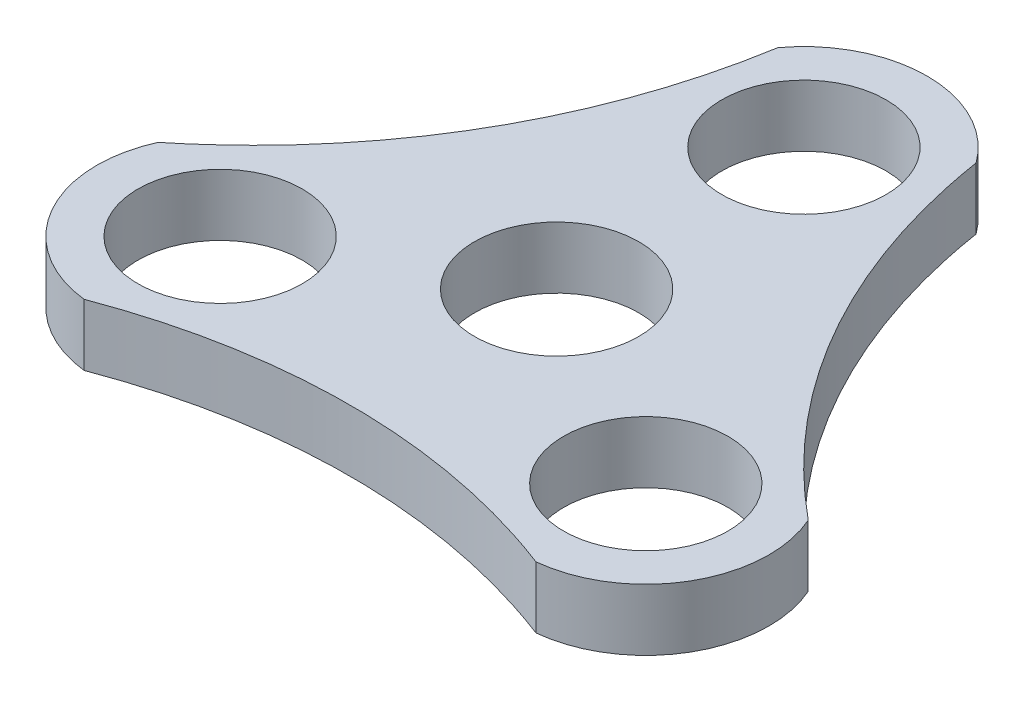
ISO-10303-21;
HEADER;
FILE_DESCRIPTION(('STEP AP214'),'2;1');
FILE_NAME('part.step','',(''),(''),'','','');
FILE_SCHEMA(('AUTOMOTIVE_DESIGN { 1 0 10303 214 1 1 1 1 }'));
ENDSEC;
DATA;
#1=APPLICATION_CONTEXT('core data for automotive mechanical design processes');
#2=APPLICATION_PROTOCOL_DEFINITION('international standard','automotive_design',2000,#1);
#3=PRODUCT_CONTEXT('',#1,'mechanical');
#4=PRODUCT('Part','Part','',(#3));
#5=PRODUCT_RELATED_PRODUCT_CATEGORY('part','',(#4));
#6=PRODUCT_DEFINITION_FORMATION('','',#4);
#7=PRODUCT_DEFINITION_CONTEXT('part definition',#1,'design');
#8=PRODUCT_DEFINITION('design','',#6,#7);
#9=PRODUCT_DEFINITION_SHAPE('','',#8);
#10=(LENGTH_UNIT() NAMED_UNIT(*) SI_UNIT(.MILLI.,.METRE.));
#11=(NAMED_UNIT(*) PLANE_ANGLE_UNIT() SI_UNIT($,.RADIAN.));
#12=(NAMED_UNIT(*) SI_UNIT($,.STERADIAN.) SOLID_ANGLE_UNIT());
#13=UNCERTAINTY_MEASURE_WITH_UNIT(LENGTH_MEASURE(1.E-05),#10,'distance_accuracy_value','');
#14=(GEOMETRIC_REPRESENTATION_CONTEXT(3) GLOBAL_UNCERTAINTY_ASSIGNED_CONTEXT((#13)) GLOBAL_UNIT_ASSIGNED_CONTEXT((#10,
#11,#12)) REPRESENTATION_CONTEXT('',''));
#15=CARTESIAN_POINT('',(0.,0.,0.));
#16=DIRECTION('',(0.,0.,1.));
#17=DIRECTION('',(1.,0.,0.));
#18=AXIS2_PLACEMENT_3D('',#15,#16,#17);
#19=CARTESIAN_POINT('',(-13.602275297926,4.7625,-7.91869783549676));
#20=DIRECTION('',(0.,1.,0.));
#21=DIRECTION('',(0.,0.,1.));
#22=AXIS2_PLACEMENT_3D('',#19,#20,#21);
#23=PLANE('',#22);
#24=CARTESIAN_POINT('',(16.4678313299762,4.7625,9.57669208482001));
#25=DIRECTION('',(0.,1.,0.));
#26=DIRECTION('',(0.,0.,1.));
#27=AXIS2_PLACEMENT_3D('',#24,#25,#26);
#28=CIRCLE('',#27,6.35);
#29=CARTESIAN_POINT('',(16.4678313299762,4.7625,3.22669208482001));
#30=VERTEX_POINT('',#29);
#31=EDGE_CURVE('E163',#30,#30,#28,.T.);
#32=ORIENTED_EDGE('',*,*,#31,.F.);
#33=EDGE_LOOP('',(#32));
#34=FACE_BOUND('',#33,.T.);
#35=CARTESIAN_POINT('',(0.,4.7625,0.));
#36=DIRECTION('',(0.,1.,0.));
#37=DIRECTION('',(0.,0.,1.));
#38=AXIS2_PLACEMENT_3D('',#35,#36,#37);
#39=CIRCLE('',#38,6.35);
#40=CARTESIAN_POINT('',(0.,4.7625,-6.35));
#41=VERTEX_POINT('',#40);
#42=EDGE_CURVE('E155',#41,#41,#39,.T.);
#43=ORIENTED_EDGE('',*,*,#42,.F.);
#44=EDGE_LOOP('',(#43));
#45=FACE_BOUND('',#44,.T.);
#46=CARTESIAN_POINT('',(-7.61008297032419,4.7625,-24.6978612702383));
#47=CARTESIAN_POINT('',(-9.59210410471239,4.7625,-12.6493938133161));
#48=CARTESIAN_POINT('',(-15.7358593196995,4.7625,-2.09722589880707));
#49=CARTESIAN_POINT('',(-25.2242291398482,4.7625,5.58813772263381));
#50=B_SPLINE_CURVE_WITH_KNOTS('',3,(#46,#47,#48,#49),.UNSPECIFIED.,.F.,.F.,(4,4),(0.,1.),.UNSPECIFIED.);
#51=CARTESIAN_POINT('',(-7.61008297032419,4.7625,-24.6978612702383));
#52=VERTEX_POINT('',#51);
#53=CARTESIAN_POINT('',(-25.2242291398482,4.7625,5.5881377226338));
#54=VERTEX_POINT('',#53);
#55=EDGE_CURVE('E144',#52,#54,#50,.T.);
#56=ORIENTED_EDGE('',*,*,#55,.T.);
#57=CARTESIAN_POINT('',(-16.5275742946636,4.7625,9.47321423458667));
#58=DIRECTION('',(0.,1.,0.));
#59=DIRECTION('',(0.,0.,1.));
#60=AXIS2_PLACEMENT_3D('',#57,#58,#59);
#61=CIRCLE('',#60,9.525);
#62=CARTESIAN_POINT('',(-17.5771173695649,4.7625,18.9402139881478));
#63=VERTEX_POINT('',#62);
#64=EDGE_CURVE('E88',#54,#63,#61,.T.);
#65=ORIENTED_EDGE('',*,*,#64,.T.);
#66=CARTESIAN_POINT('',(-17.5771173695649,4.7625,18.9402139881478));
#67=CARTESIAN_POINT('',(-6.15200852896618,4.7625,14.6319818892297));
#68=CARTESIAN_POINT('',(6.05831641519707,4.7625,14.6760340812267));
#69=CARTESIAN_POINT('',(17.4584048576285,4.7625,19.0500436082416));
#70=B_SPLINE_CURVE_WITH_KNOTS('',3,(#66,#67,#68,#69),.UNSPECIFIED.,.F.,.F.,(4,4),(0.,1.),.UNSPECIFIED.);
#71=CARTESIAN_POINT('',(17.4584048576285,4.7625,19.0500436082416));
#72=VERTEX_POINT('',#71);
#73=EDGE_CURVE('E101',#63,#72,#70,.T.);
#74=ORIENTED_EDGE('',*,*,#73,.T.);
#75=CARTESIAN_POINT('',(16.4678313299762,4.7625,9.57669208482001));
#76=DIRECTION('',(0.,1.,0.));
#77=DIRECTION('',(0.,0.,1.));
#78=AXIS2_PLACEMENT_3D('',#75,#76,#77);
#79=CIRCLE('',#78,9.525);
#80=CARTESIAN_POINT('',(25.1877510255061,4.7625,5.74411781893687));
#81=VERTEX_POINT('',#80);
#82=EDGE_CURVE('E95',#72,#81,#79,.T.);
#83=ORIENTED_EDGE('',*,*,#82,.T.);
#84=CARTESIAN_POINT('',(25.1877510255061,4.7625,5.74411781893687));
#85=CARTESIAN_POINT('',(15.7437444551005,4.7625,-1.99569585684444));
#86=CARTESIAN_POINT('',(9.67616592661354,4.7625,-12.5918492456133));
#87=CARTESIAN_POINT('',(7.76348047936323,4.7625,-24.6515179897187));
#88=B_SPLINE_CURVE_WITH_KNOTS('',3,(#84,#85,#86,#87),.UNSPECIFIED.,.F.,.F.,(4,4),(0.,1.),.UNSPECIFIED.);
#89=CARTESIAN_POINT('',(7.76348047936323,4.7625,-24.6515179897187));
#90=VERTEX_POINT('',#89);
#91=EDGE_CURVE('E99',#81,#90,#88,.T.);
#92=ORIENTED_EDGE('',*,*,#91,.T.);
#93=CARTESIAN_POINT('',(0.0597429646873883,4.7625,-19.0499063194067));
#94=DIRECTION('',(0.,1.,0.));
#95=DIRECTION('',(0.,0.,1.));
#96=AXIS2_PLACEMENT_3D('',#93,#94,#95);
#97=CIRCLE('',#96,9.525);
#98=EDGE_CURVE('E51',#90,#52,#97,.T.);
#99=ORIENTED_EDGE('',*,*,#98,.T.);
#100=EDGE_LOOP('',(#56,#65,#74,#83,#92,#99));
#101=FACE_BOUND('',#100,.T.);
#102=CARTESIAN_POINT('',(0.0597429646873883,4.7625,-19.0499063194067));
#103=DIRECTION('',(0.,1.,0.));
#104=DIRECTION('',(0.,0.,1.));
#105=AXIS2_PLACEMENT_3D('',#102,#103,#104);
#106=CIRCLE('',#105,6.35);
#107=CARTESIAN_POINT('',(0.0597429646873883,4.7625,-25.3999063194067));
#108=VERTEX_POINT('',#107);
#109=EDGE_CURVE('E156',#108,#108,#106,.T.);
#110=ORIENTED_EDGE('',*,*,#109,.F.);
#111=EDGE_LOOP('',(#110));
#112=FACE_BOUND('',#111,.T.);
#113=CARTESIAN_POINT('',(-16.5275742946636,4.7625,9.47321423458667));
#114=DIRECTION('',(0.,1.,0.));
#115=DIRECTION('',(0.,0.,1.));
#116=AXIS2_PLACEMENT_3D('',#113,#114,#115);
#117=CIRCLE('',#116,6.35);
#118=CARTESIAN_POINT('',(-16.5275742946636,4.7625,3.12321423458667));
#119=VERTEX_POINT('',#118);
#120=EDGE_CURVE('E169',#119,#119,#117,.T.);
#121=ORIENTED_EDGE('',*,*,#120,.F.);
#122=EDGE_LOOP('',(#121));
#123=FACE_BOUND('',#122,.T.);
#124=ADVANCED_FACE('F33',(#34,#45,#101,#112,#123),#23,.T.);
#125=CARTESIAN_POINT('',(-13.602275297926,0.,-7.91869783549676));
#126=DIRECTION('',(0.,1.,0.));
#127=DIRECTION('',(0.,0.,1.));
#128=AXIS2_PLACEMENT_3D('',#125,#126,#127);
#129=PLANE('',#128);
#130=CARTESIAN_POINT('',(-7.61008297032419,0.,-24.6978612702383));
#131=CARTESIAN_POINT('',(-9.59210410471239,0.,-12.6493938133161));
#132=CARTESIAN_POINT('',(-15.7358593196995,0.,-2.09722589880707));
#133=CARTESIAN_POINT('',(-25.2242291398482,0.,5.58813772263381));
#134=B_SPLINE_CURVE_WITH_KNOTS('',3,(#130,#131,#132,#133),.UNSPECIFIED.,.F.,.F.,(4,4),(0.,1.),.UNSPECIFIED.);
#135=CARTESIAN_POINT('',(-7.61008297032419,0.,-24.6978612702383));
#136=VERTEX_POINT('',#135);
#137=CARTESIAN_POINT('',(-25.2242291398482,0.,5.5881377226338));
#138=VERTEX_POINT('',#137);
#139=EDGE_CURVE('E159',#136,#138,#134,.T.);
#140=ORIENTED_EDGE('',*,*,#139,.F.);
#141=CARTESIAN_POINT('',(0.0597429646873883,0.,-19.0499063194067));
#142=DIRECTION('',(0.,1.,0.));
#143=DIRECTION('',(0.,0.,1.));
#144=AXIS2_PLACEMENT_3D('',#141,#142,#143);
#145=CIRCLE('',#144,9.525);
#146=CARTESIAN_POINT('',(7.76348047936323,0.,-24.6515179897187));
#147=VERTEX_POINT('',#146);
#148=EDGE_CURVE('E80',#147,#136,#145,.T.);
#149=ORIENTED_EDGE('',*,*,#148,.F.);
#150=CARTESIAN_POINT('',(25.1877510255061,0.,5.74411781893687));
#151=CARTESIAN_POINT('',(15.7437444551005,0.,-1.99569585684444));
#152=CARTESIAN_POINT('',(9.67616592661354,0.,-12.5918492456133));
#153=CARTESIAN_POINT('',(7.76348047936323,0.,-24.6515179897187));
#154=B_SPLINE_CURVE_WITH_KNOTS('',3,(#150,#151,#152,#153),.UNSPECIFIED.,.F.,.F.,(4,4),(0.,1.),.UNSPECIFIED.);
#155=CARTESIAN_POINT('',(25.1877510255061,0.,5.74411781893687));
#156=VERTEX_POINT('',#155);
#157=EDGE_CURVE('E74',#156,#147,#154,.T.);
#158=ORIENTED_EDGE('',*,*,#157,.F.);
#159=CARTESIAN_POINT('',(16.4678313299762,0.,9.57669208482001));
#160=DIRECTION('',(0.,1.,0.));
#161=DIRECTION('',(0.,0.,1.));
#162=AXIS2_PLACEMENT_3D('',#159,#160,#161);
#163=CIRCLE('',#162,9.525);
#164=CARTESIAN_POINT('',(17.4584048576285,0.,19.0500436082416));
#165=VERTEX_POINT('',#164);
#166=EDGE_CURVE('E109',#165,#156,#163,.T.);
#167=ORIENTED_EDGE('',*,*,#166,.F.);
#168=CARTESIAN_POINT('',(-17.5771173695649,0.,18.9402139881478));
#169=CARTESIAN_POINT('',(-6.15200852896618,0.,14.6319818892297));
#170=CARTESIAN_POINT('',(6.05831641519707,0.,14.6760340812267));
#171=CARTESIAN_POINT('',(17.4584048576285,0.,19.0500436082416));
#172=B_SPLINE_CURVE_WITH_KNOTS('',3,(#168,#169,#170,#171),.UNSPECIFIED.,.F.,.F.,(4,4),(0.,1.),.UNSPECIFIED.);
#173=CARTESIAN_POINT('',(-17.5771173695649,0.,18.9402139881478));
#174=VERTEX_POINT('',#173);
#175=EDGE_CURVE('E284',#174,#165,#172,.T.);
#176=ORIENTED_EDGE('',*,*,#175,.F.);
#177=CARTESIAN_POINT('',(-16.5275742946636,0.,9.47321423458667));
#178=DIRECTION('',(0.,1.,0.));
#179=DIRECTION('',(0.,0.,1.));
#180=AXIS2_PLACEMENT_3D('',#177,#178,#179);
#181=CIRCLE('',#180,9.525);
#182=EDGE_CURVE('E283',#138,#174,#181,.T.);
#183=ORIENTED_EDGE('',*,*,#182,.F.);
#184=EDGE_LOOP('',(#140,#149,#158,#167,#176,#183));
#185=FACE_BOUND('',#184,.T.);
#186=CARTESIAN_POINT('',(0.,0.,0.));
#187=DIRECTION('',(0.,1.,0.));
#188=DIRECTION('',(0.,0.,1.));
#189=AXIS2_PLACEMENT_3D('',#186,#187,#188);
#190=CIRCLE('',#189,6.35);
#191=CARTESIAN_POINT('',(0.,0.,-6.35));
#192=VERTEX_POINT('',#191);
#193=EDGE_CURVE('E149',#192,#192,#190,.T.);
#194=ORIENTED_EDGE('',*,*,#193,.T.);
#195=EDGE_LOOP('',(#194));
#196=FACE_BOUND('',#195,.T.);
#197=CARTESIAN_POINT('',(0.0597429646873883,0.,-19.0499063194067));
#198=DIRECTION('',(0.,1.,0.));
#199=DIRECTION('',(0.,0.,1.));
#200=AXIS2_PLACEMENT_3D('',#197,#198,#199);
#201=CIRCLE('',#200,6.35);
#202=CARTESIAN_POINT('',(0.0597429646873883,0.,-25.3999063194067));
#203=VERTEX_POINT('',#202);
#204=EDGE_CURVE('E160',#203,#203,#201,.T.);
#205=ORIENTED_EDGE('',*,*,#204,.T.);
#206=EDGE_LOOP('',(#205));
#207=FACE_BOUND('',#206,.T.);
#208=CARTESIAN_POINT('',(16.4678313299762,0.,9.57669208482001));
#209=DIRECTION('',(0.,1.,0.));
#210=DIRECTION('',(0.,0.,1.));
#211=AXIS2_PLACEMENT_3D('',#208,#209,#210);
#212=CIRCLE('',#211,6.35);
#213=CARTESIAN_POINT('',(16.4678313299762,0.,3.22669208482001));
#214=VERTEX_POINT('',#213);
#215=EDGE_CURVE('E166',#214,#214,#212,.T.);
#216=ORIENTED_EDGE('',*,*,#215,.T.);
#217=EDGE_LOOP('',(#216));
#218=FACE_BOUND('',#217,.T.);
#219=CARTESIAN_POINT('',(-16.5275742946636,0.,9.47321423458667));
#220=DIRECTION('',(0.,1.,0.));
#221=DIRECTION('',(0.,0.,1.));
#222=AXIS2_PLACEMENT_3D('',#219,#220,#221);
#223=CIRCLE('',#222,6.35);
#224=CARTESIAN_POINT('',(-16.5275742946636,0.,3.12321423458667));
#225=VERTEX_POINT('',#224);
#226=EDGE_CURVE('E172',#225,#225,#223,.T.);
#227=ORIENTED_EDGE('',*,*,#226,.T.);
#228=EDGE_LOOP('',(#227));
#229=FACE_BOUND('',#228,.T.);
#230=ADVANCED_FACE('F182',(#185,#196,#207,#218,#229),#129,.F.);
#231=DIRECTION('',(0.,-1.,0.));
#232=VECTOR('',#231,1.);
#233=SURFACE_OF_LINEAR_EXTRUSION('',#50,#232);
#234=ORIENTED_EDGE('',*,*,#139,.T.);
#235=DIRECTION('',(0.,-1.,0.));
#236=VECTOR('',#235,1.);
#237=CARTESIAN_POINT('',(-25.2242291398482,4.7625,5.5881377226338));
#238=LINE('',#237,#236);
#239=EDGE_CURVE('E11',#54,#138,#238,.T.);
#240=ORIENTED_EDGE('',*,*,#239,.F.);
#241=ORIENTED_EDGE('',*,*,#55,.F.);
#242=DIRECTION('',(0.,-1.,0.));
#243=VECTOR('',#242,1.);
#244=CARTESIAN_POINT('',(-7.61008297032419,4.7625,-24.6978612702383));
#245=LINE('',#244,#243);
#246=EDGE_CURVE('E115',#52,#136,#245,.T.);
#247=ORIENTED_EDGE('',*,*,#246,.T.);
#248=EDGE_LOOP('',(#234,#240,#241,#247));
#249=FACE_BOUND('',#248,.T.);
#250=ADVANCED_FACE('F35',(#249),#233,.F.);
#251=CARTESIAN_POINT('',(-16.5275742946636,4.7625,9.47321423458667));
#252=DIRECTION('',(0.,-1.,0.));
#253=DIRECTION('',(0.,0.,-1.));
#254=AXIS2_PLACEMENT_3D('',#251,#252,#253);
#255=CYLINDRICAL_SURFACE('',#254,9.525);
#256=ORIENTED_EDGE('',*,*,#182,.T.);
#257=DIRECTION('',(0.,-1.,0.));
#258=VECTOR('',#257,1.);
#259=CARTESIAN_POINT('',(-17.5771173695649,4.7625,18.9402139881478));
#260=LINE('',#259,#258);
#261=EDGE_CURVE('E43',#63,#174,#260,.T.);
#262=ORIENTED_EDGE('',*,*,#261,.F.);
#263=ORIENTED_EDGE('',*,*,#64,.F.);
#264=ORIENTED_EDGE('',*,*,#239,.T.);
#265=EDGE_LOOP('',(#256,#262,#263,#264));
#266=FACE_BOUND('',#265,.T.);
#267=ADVANCED_FACE('F135',(#266),#255,.T.);
#268=DIRECTION('',(0.,-1.,0.));
#269=VECTOR('',#268,1.);
#270=SURFACE_OF_LINEAR_EXTRUSION('',#70,#269);
#271=ORIENTED_EDGE('',*,*,#175,.T.);
#272=DIRECTION('',(0.,-1.,0.));
#273=VECTOR('',#272,1.);
#274=CARTESIAN_POINT('',(17.4584048576285,4.7625,19.0500436082416));
#275=LINE('',#274,#273);
#276=EDGE_CURVE('E110',#72,#165,#275,.T.);
#277=ORIENTED_EDGE('',*,*,#276,.F.);
#278=ORIENTED_EDGE('',*,*,#73,.F.);
#279=ORIENTED_EDGE('',*,*,#261,.T.);
#280=EDGE_LOOP('',(#271,#277,#278,#279));
#281=FACE_BOUND('',#280,.T.);
#282=ADVANCED_FACE('F133',(#281),#270,.F.);
#283=CARTESIAN_POINT('',(16.4678313299762,4.7625,9.57669208482001));
#284=DIRECTION('',(0.,-1.,0.));
#285=DIRECTION('',(0.,0.,-1.));
#286=AXIS2_PLACEMENT_3D('',#283,#284,#285);
#287=CYLINDRICAL_SURFACE('',#286,9.525);
#288=ORIENTED_EDGE('',*,*,#166,.T.);
#289=DIRECTION('',(0.,-1.,0.));
#290=VECTOR('',#289,1.);
#291=CARTESIAN_POINT('',(25.1877510255061,4.7625,5.74411781893687));
#292=LINE('',#291,#290);
#293=EDGE_CURVE('E106',#81,#156,#292,.T.);
#294=ORIENTED_EDGE('',*,*,#293,.F.);
#295=ORIENTED_EDGE('',*,*,#82,.F.);
#296=ORIENTED_EDGE('',*,*,#276,.T.);
#297=EDGE_LOOP('',(#288,#294,#295,#296));
#298=FACE_BOUND('',#297,.T.);
#299=ADVANCED_FACE('F107',(#298),#287,.T.);
#300=DIRECTION('',(0.,-1.,0.));
#301=VECTOR('',#300,1.);
#302=SURFACE_OF_LINEAR_EXTRUSION('',#88,#301);
#303=ORIENTED_EDGE('',*,*,#157,.T.);
#304=DIRECTION('',(0.,-1.,0.));
#305=VECTOR('',#304,1.);
#306=CARTESIAN_POINT('',(7.76348047936323,4.7625,-24.6515179897187));
#307=LINE('',#306,#305);
#308=EDGE_CURVE('E111',#90,#147,#307,.T.);
#309=ORIENTED_EDGE('',*,*,#308,.F.);
#310=ORIENTED_EDGE('',*,*,#91,.F.);
#311=ORIENTED_EDGE('',*,*,#293,.T.);
#312=EDGE_LOOP('',(#303,#309,#310,#311));
#313=FACE_BOUND('',#312,.T.);
#314=ADVANCED_FACE('F113',(#313),#302,.F.);
#315=CARTESIAN_POINT('',(0.0597429646873883,4.7625,-19.0499063194067));
#316=DIRECTION('',(0.,-1.,0.));
#317=DIRECTION('',(0.,0.,-1.));
#318=AXIS2_PLACEMENT_3D('',#315,#316,#317);
#319=CYLINDRICAL_SURFACE('',#318,9.525);
#320=ORIENTED_EDGE('',*,*,#148,.T.);
#321=ORIENTED_EDGE('',*,*,#246,.F.);
#322=ORIENTED_EDGE('',*,*,#98,.F.);
#323=ORIENTED_EDGE('',*,*,#308,.T.);
#324=EDGE_LOOP('',(#320,#321,#322,#323));
#325=FACE_BOUND('',#324,.T.);
#326=ADVANCED_FACE('F129',(#325),#319,.T.);
#327=CARTESIAN_POINT('',(0.,4.7625,0.));
#328=DIRECTION('',(0.,-1.,0.));
#329=DIRECTION('',(0.,0.,-1.));
#330=AXIS2_PLACEMENT_3D('',#327,#328,#329);
#331=CYLINDRICAL_SURFACE('',#330,6.35);
#332=CARTESIAN_POINT('',(0.,4.7625,-6.35));
#333=CARTESIAN_POINT('',(0.,4.712890625,-6.35));
#334=CARTESIAN_POINT('',(0.,4.66328125,-6.35));
#335=CARTESIAN_POINT('',(0.,4.5640625,-6.35));
#336=CARTESIAN_POINT('',(0.,4.514453125,-6.35));
#337=CARTESIAN_POINT('',(0.,4.415234375,-6.35));
#338=CARTESIAN_POINT('',(0.,4.365625,-6.35));
#339=CARTESIAN_POINT('',(0.,4.26640625,-6.35));
#340=CARTESIAN_POINT('',(0.,4.216796875,-6.35));
#341=CARTESIAN_POINT('',(0.,4.117578125,-6.35));
#342=CARTESIAN_POINT('',(0.,4.06796875,-6.35));
#343=CARTESIAN_POINT('',(0.,3.96875,-6.35));
#344=CARTESIAN_POINT('',(0.,3.919140625,-6.35));
#345=CARTESIAN_POINT('',(0.,3.819921875,-6.35));
#346=CARTESIAN_POINT('',(0.,3.7703125,-6.35));
#347=CARTESIAN_POINT('',(0.,3.67109375,-6.35));
#348=CARTESIAN_POINT('',(0.,3.621484375,-6.35));
#349=CARTESIAN_POINT('',(0.,3.522265625,-6.35));
#350=CARTESIAN_POINT('',(0.,3.47265625,-6.35));
#351=CARTESIAN_POINT('',(0.,3.3734375,-6.35));
#352=CARTESIAN_POINT('',(0.,3.323828125,-6.35));
#353=CARTESIAN_POINT('',(0.,3.224609375,-6.35));
#354=CARTESIAN_POINT('',(0.,3.175,-6.35));
#355=CARTESIAN_POINT('',(0.,3.07578125,-6.35));
#356=CARTESIAN_POINT('',(0.,3.026171875,-6.35));
#357=CARTESIAN_POINT('',(0.,2.926953125,-6.35));
#358=CARTESIAN_POINT('',(0.,2.87734375,-6.35));
#359=CARTESIAN_POINT('',(0.,2.778125,-6.35));
#360=CARTESIAN_POINT('',(0.,2.728515625,-6.35));
#361=CARTESIAN_POINT('',(0.,2.629296875,-6.35));
#362=CARTESIAN_POINT('',(0.,2.5796875,-6.35));
#363=CARTESIAN_POINT('',(0.,2.48046875,-6.35));
#364=CARTESIAN_POINT('',(0.,2.430859375,-6.35));
#365=CARTESIAN_POINT('',(0.,2.331640625,-6.35));
#366=CARTESIAN_POINT('',(0.,2.28203125,-6.35));
#367=CARTESIAN_POINT('',(0.,2.1828125,-6.35));
#368=CARTESIAN_POINT('',(0.,2.133203125,-6.35));
#369=CARTESIAN_POINT('',(0.,2.033984375,-6.35));
#370=CARTESIAN_POINT('',(0.,1.984375,-6.35));
#371=CARTESIAN_POINT('',(0.,1.88515625,-6.35));
#372=CARTESIAN_POINT('',(0.,1.835546875,-6.35));
#373=CARTESIAN_POINT('',(0.,1.736328125,-6.35));
#374=CARTESIAN_POINT('',(0.,1.68671875,-6.35));
#375=CARTESIAN_POINT('',(0.,1.5875,-6.35));
#376=CARTESIAN_POINT('',(0.,1.537890625,-6.35));
#377=CARTESIAN_POINT('',(0.,1.438671875,-6.35));
#378=CARTESIAN_POINT('',(0.,1.3890625,-6.35));
#379=CARTESIAN_POINT('',(0.,1.28984375,-6.35));
#380=CARTESIAN_POINT('',(0.,1.240234375,-6.35));
#381=CARTESIAN_POINT('',(0.,1.141015625,-6.35));
#382=CARTESIAN_POINT('',(0.,1.09140625,-6.35));
#383=CARTESIAN_POINT('',(0.,0.992187499999999,-6.35));
#384=CARTESIAN_POINT('',(0.,0.942578124999999,-6.35));
#385=CARTESIAN_POINT('',(0.,0.843359375,-6.35));
#386=CARTESIAN_POINT('',(0.,0.79375,-6.35));
#387=CARTESIAN_POINT('',(0.,0.69453125,-6.35));
#388=CARTESIAN_POINT('',(0.,0.644921875,-6.35));
#389=CARTESIAN_POINT('',(0.,0.545703125,-6.35));
#390=CARTESIAN_POINT('',(0.,0.49609375,-6.35));
#391=CARTESIAN_POINT('',(0.,0.396875,-6.35));
#392=CARTESIAN_POINT('',(0.,0.347265625,-6.35));
#393=CARTESIAN_POINT('',(0.,0.248046875,-6.35));
#394=CARTESIAN_POINT('',(0.,0.1984375,-6.35));
#395=CARTESIAN_POINT('',(0.,0.09921875,-6.35));
#396=CARTESIAN_POINT('',(0.,0.049609375,-6.35));
#397=CARTESIAN_POINT('',(0.,0.,-6.35));
#398=B_SPLINE_CURVE_WITH_KNOTS('',3,(#332,#333,#334,#335,#336,#337,#338,#339,#340,#341,#342,
#343,#344,#345,#346,#347,#348,#349,#350,#351,#352,#353,#354,#355,#356,#357,#358,#359,#360,#361,
#362,#363,#364,#365,#366,#367,#368,#369,#370,#371,#372,#373,#374,#375,#376,#377,#378,#379,#380,
#381,#382,#383,#384,#385,#386,#387,#388,#389,#390,#391,#392,#393,#394,#395,#396,#397),
.UNSPECIFIED.,.F.,.F.,(4,2,2,2,2,2,2,2,2,2,2,2,2,2,2,2,2,2,2,2,2,2,2,2,2,2,2,2,2,2,2,2,4),(0.,
0.148828125,0.29765625,0.446484375,0.5953125,0.744140625,0.892968750000001,1.041796875,1.190625,
1.339453125,1.48828125,1.637109375,1.7859375,1.934765625,2.08359375,2.232421875,2.38125,
2.530078125,2.67890625,2.827734375,2.9765625,3.125390625,3.27421875,3.423046875,3.571875,
3.720703125,3.86953125,4.018359375,4.1671875,4.316015625,4.46484375,4.613671875,4.7625),.UNSPECIFIED.);
#399=EDGE_CURVE('BSEAM192',#41,#192,#398,.T.);
#400=ORIENTED_EDGE('',*,*,#42,.T.);
#401=ORIENTED_EDGE('',*,*,#193,.F.);
#402=ORIENTED_EDGE('',*,*,#399,.T.);
#403=ORIENTED_EDGE('',*,*,#399,.F.);
#404=EDGE_LOOP('',(#400,#402,#401,#403));
#405=FACE_BOUND('',#404,.T.);
#406=ADVANCED_FACE('F192',(#405),#331,.F.);
#407=CARTESIAN_POINT('',(0.0597429646873883,4.7625,-19.0499063194067));
#408=DIRECTION('',(0.,-1.,0.));
#409=DIRECTION('',(0.,0.,-1.));
#410=AXIS2_PLACEMENT_3D('',#407,#408,#409);
#411=CYLINDRICAL_SURFACE('',#410,6.35);
#412=CARTESIAN_POINT('',(0.0597429646873883,4.7625,-25.3999063194067));
#413=CARTESIAN_POINT('',(0.0597429646873883,4.712890625,-25.3999063194067));
#414=CARTESIAN_POINT('',(0.0597429646873883,4.66328125,-25.3999063194067));
#415=CARTESIAN_POINT('',(0.0597429646873883,4.5640625,-25.3999063194067));
#416=CARTESIAN_POINT('',(0.0597429646873883,4.514453125,-25.3999063194067));
#417=CARTESIAN_POINT('',(0.0597429646873883,4.415234375,-25.3999063194067));
#418=CARTESIAN_POINT('',(0.0597429646873883,4.365625,-25.3999063194067));
#419=CARTESIAN_POINT('',(0.0597429646873883,4.26640625,-25.3999063194067));
#420=CARTESIAN_POINT('',(0.0597429646873883,4.216796875,-25.3999063194067));
#421=CARTESIAN_POINT('',(0.0597429646873883,4.117578125,-25.3999063194067));
#422=CARTESIAN_POINT('',(0.0597429646873883,4.06796875,-25.3999063194067));
#423=CARTESIAN_POINT('',(0.0597429646873883,3.96875,-25.3999063194067));
#424=CARTESIAN_POINT('',(0.0597429646873883,3.919140625,-25.3999063194067));
#425=CARTESIAN_POINT('',(0.0597429646873883,3.819921875,-25.3999063194067));
#426=CARTESIAN_POINT('',(0.0597429646873883,3.7703125,-25.3999063194067));
#427=CARTESIAN_POINT('',(0.0597429646873883,3.67109375,-25.3999063194067));
#428=CARTESIAN_POINT('',(0.0597429646873883,3.621484375,-25.3999063194067));
#429=CARTESIAN_POINT('',(0.0597429646873883,3.522265625,-25.3999063194067));
#430=CARTESIAN_POINT('',(0.0597429646873883,3.47265625,-25.3999063194067));
#431=CARTESIAN_POINT('',(0.0597429646873883,3.3734375,-25.3999063194067));
#432=CARTESIAN_POINT('',(0.0597429646873883,3.323828125,-25.3999063194067));
#433=CARTESIAN_POINT('',(0.0597429646873883,3.224609375,-25.3999063194067));
#434=CARTESIAN_POINT('',(0.0597429646873883,3.175,-25.3999063194067));
#435=CARTESIAN_POINT('',(0.0597429646873883,3.07578125,-25.3999063194067));
#436=CARTESIAN_POINT('',(0.0597429646873883,3.026171875,-25.3999063194067));
#437=CARTESIAN_POINT('',(0.0597429646873883,2.926953125,-25.3999063194067));
#438=CARTESIAN_POINT('',(0.0597429646873883,2.87734375,-25.3999063194067));
#439=CARTESIAN_POINT('',(0.0597429646873883,2.778125,-25.3999063194067));
#440=CARTESIAN_POINT('',(0.0597429646873883,2.728515625,-25.3999063194067));
#441=CARTESIAN_POINT('',(0.0597429646873883,2.629296875,-25.3999063194067));
#442=CARTESIAN_POINT('',(0.0597429646873883,2.5796875,-25.3999063194067));
#443=CARTESIAN_POINT('',(0.0597429646873883,2.48046875,-25.3999063194067));
#444=CARTESIAN_POINT('',(0.0597429646873883,2.430859375,-25.3999063194067));
#445=CARTESIAN_POINT('',(0.0597429646873883,2.331640625,-25.3999063194067));
#446=CARTESIAN_POINT('',(0.0597429646873883,2.28203125,-25.3999063194067));
#447=CARTESIAN_POINT('',(0.0597429646873883,2.1828125,-25.3999063194067));
#448=CARTESIAN_POINT('',(0.0597429646873883,2.133203125,-25.3999063194067));
#449=CARTESIAN_POINT('',(0.0597429646873883,2.033984375,-25.3999063194067));
#450=CARTESIAN_POINT('',(0.0597429646873883,1.984375,-25.3999063194067));
#451=CARTESIAN_POINT('',(0.0597429646873883,1.88515625,-25.3999063194067));
#452=CARTESIAN_POINT('',(0.0597429646873883,1.835546875,-25.3999063194067));
#453=CARTESIAN_POINT('',(0.0597429646873883,1.736328125,-25.3999063194067));
#454=CARTESIAN_POINT('',(0.0597429646873883,1.68671875,-25.3999063194067));
#455=CARTESIAN_POINT('',(0.0597429646873883,1.5875,-25.3999063194067));
#456=CARTESIAN_POINT('',(0.0597429646873883,1.537890625,-25.3999063194067));
#457=CARTESIAN_POINT('',(0.0597429646873883,1.438671875,-25.3999063194067));
#458=CARTESIAN_POINT('',(0.0597429646873883,1.3890625,-25.3999063194067));
#459=CARTESIAN_POINT('',(0.0597429646873883,1.28984375,-25.3999063194067));
#460=CARTESIAN_POINT('',(0.0597429646873883,1.240234375,-25.3999063194067));
#461=CARTESIAN_POINT('',(0.0597429646873883,1.141015625,-25.3999063194067));
#462=CARTESIAN_POINT('',(0.0597429646873883,1.09140625,-25.3999063194067));
#463=CARTESIAN_POINT('',(0.0597429646873883,0.992187499999999,-25.3999063194067));
#464=CARTESIAN_POINT('',(0.0597429646873883,0.942578124999999,-25.3999063194067));
#465=CARTESIAN_POINT('',(0.0597429646873883,0.843359375,-25.3999063194067));
#466=CARTESIAN_POINT('',(0.0597429646873883,0.79375,-25.3999063194067));
#467=CARTESIAN_POINT('',(0.0597429646873883,0.69453125,-25.3999063194067));
#468=CARTESIAN_POINT('',(0.0597429646873883,0.644921875,-25.3999063194067));
#469=CARTESIAN_POINT('',(0.0597429646873883,0.545703125,-25.3999063194067));
#470=CARTESIAN_POINT('',(0.0597429646873883,0.49609375,-25.3999063194067));
#471=CARTESIAN_POINT('',(0.0597429646873883,0.396875,-25.3999063194067));
#472=CARTESIAN_POINT('',(0.0597429646873883,0.347265625,-25.3999063194067));
#473=CARTESIAN_POINT('',(0.0597429646873883,0.248046875,-25.3999063194067));
#474=CARTESIAN_POINT('',(0.0597429646873883,0.1984375,-25.3999063194067));
#475=CARTESIAN_POINT('',(0.0597429646873883,0.09921875,-25.3999063194067));
#476=CARTESIAN_POINT('',(0.0597429646873883,0.049609375,-25.3999063194067));
#477=CARTESIAN_POINT('',(0.0597429646873883,0.,-25.3999063194067));
#478=B_SPLINE_CURVE_WITH_KNOTS('',3,(#412,#413,#414,#415,#416,#417,#418,#419,#420,#421,#422,
#423,#424,#425,#426,#427,#428,#429,#430,#431,#432,#433,#434,#435,#436,#437,#438,#439,#440,#441,
#442,#443,#444,#445,#446,#447,#448,#449,#450,#451,#452,#453,#454,#455,#456,#457,#458,#459,#460,
#461,#462,#463,#464,#465,#466,#467,#468,#469,#470,#471,#472,#473,#474,#475,#476,#477),
.UNSPECIFIED.,.F.,.F.,(4,2,2,2,2,2,2,2,2,2,2,2,2,2,2,2,2,2,2,2,2,2,2,2,2,2,2,2,2,2,2,2,4),(0.,
0.148828125,0.29765625,0.446484375,0.5953125,0.744140625,0.892968750000001,1.041796875,1.190625,
1.339453125,1.48828125,1.637109375,1.7859375,1.934765625,2.08359375,2.232421875,2.38125,
2.530078125,2.67890625,2.827734375,2.9765625,3.125390625,3.27421875,3.423046875,3.571875,
3.720703125,3.86953125,4.018359375,4.1671875,4.316015625,4.46484375,4.613671875,4.7625),.UNSPECIFIED.);
#479=EDGE_CURVE('BSEAM195',#108,#203,#478,.T.);
#480=ORIENTED_EDGE('',*,*,#109,.T.);
#481=ORIENTED_EDGE('',*,*,#204,.F.);
#482=ORIENTED_EDGE('',*,*,#479,.T.);
#483=ORIENTED_EDGE('',*,*,#479,.F.);
#484=EDGE_LOOP('',(#480,#482,#481,#483));
#485=FACE_BOUND('',#484,.T.);
#486=ADVANCED_FACE('F195',(#485),#411,.F.);
#487=CARTESIAN_POINT('',(16.4678313299762,4.7625,9.57669208482001));
#488=DIRECTION('',(0.,-1.,0.));
#489=DIRECTION('',(0.,0.,-1.));
#490=AXIS2_PLACEMENT_3D('',#487,#488,#489);
#491=CYLINDRICAL_SURFACE('',#490,6.35);
#492=CARTESIAN_POINT('',(16.4678313299762,4.7625,3.22669208482001));
#493=CARTESIAN_POINT('',(16.4678313299762,4.712890625,3.22669208482001));
#494=CARTESIAN_POINT('',(16.4678313299762,4.66328125,3.22669208482001));
#495=CARTESIAN_POINT('',(16.4678313299762,4.5640625,3.22669208482001));
#496=CARTESIAN_POINT('',(16.4678313299762,4.514453125,3.22669208482001));
#497=CARTESIAN_POINT('',(16.4678313299762,4.415234375,3.22669208482001));
#498=CARTESIAN_POINT('',(16.4678313299762,4.365625,3.22669208482001));
#499=CARTESIAN_POINT('',(16.4678313299762,4.26640625,3.22669208482001));
#500=CARTESIAN_POINT('',(16.4678313299762,4.216796875,3.22669208482001));
#501=CARTESIAN_POINT('',(16.4678313299762,4.117578125,3.22669208482001));
#502=CARTESIAN_POINT('',(16.4678313299762,4.06796875,3.22669208482001));
#503=CARTESIAN_POINT('',(16.4678313299762,3.96875,3.22669208482001));
#504=CARTESIAN_POINT('',(16.4678313299762,3.919140625,3.22669208482001));
#505=CARTESIAN_POINT('',(16.4678313299762,3.819921875,3.22669208482001));
#506=CARTESIAN_POINT('',(16.4678313299762,3.7703125,3.22669208482001));
#507=CARTESIAN_POINT('',(16.4678313299762,3.67109375,3.22669208482001));
#508=CARTESIAN_POINT('',(16.4678313299762,3.621484375,3.22669208482001));
#509=CARTESIAN_POINT('',(16.4678313299762,3.522265625,3.22669208482001));
#510=CARTESIAN_POINT('',(16.4678313299762,3.47265625,3.22669208482001));
#511=CARTESIAN_POINT('',(16.4678313299762,3.3734375,3.22669208482001));
#512=CARTESIAN_POINT('',(16.4678313299762,3.323828125,3.22669208482001));
#513=CARTESIAN_POINT('',(16.4678313299762,3.224609375,3.22669208482001));
#514=CARTESIAN_POINT('',(16.4678313299762,3.175,3.22669208482001));
#515=CARTESIAN_POINT('',(16.4678313299762,3.07578125,3.22669208482001));
#516=CARTESIAN_POINT('',(16.4678313299762,3.026171875,3.22669208482001));
#517=CARTESIAN_POINT('',(16.4678313299762,2.926953125,3.22669208482001));
#518=CARTESIAN_POINT('',(16.4678313299762,2.87734375,3.22669208482001));
#519=CARTESIAN_POINT('',(16.4678313299762,2.778125,3.22669208482001));
#520=CARTESIAN_POINT('',(16.4678313299762,2.728515625,3.22669208482001));
#521=CARTESIAN_POINT('',(16.4678313299762,2.629296875,3.22669208482001));
#522=CARTESIAN_POINT('',(16.4678313299762,2.5796875,3.22669208482001));
#523=CARTESIAN_POINT('',(16.4678313299762,2.48046875,3.22669208482001));
#524=CARTESIAN_POINT('',(16.4678313299762,2.430859375,3.22669208482001));
#525=CARTESIAN_POINT('',(16.4678313299762,2.331640625,3.22669208482001));
#526=CARTESIAN_POINT('',(16.4678313299762,2.28203125,3.22669208482001));
#527=CARTESIAN_POINT('',(16.4678313299762,2.1828125,3.22669208482001));
#528=CARTESIAN_POINT('',(16.4678313299762,2.133203125,3.22669208482001));
#529=CARTESIAN_POINT('',(16.4678313299762,2.033984375,3.22669208482001));
#530=CARTESIAN_POINT('',(16.4678313299762,1.984375,3.22669208482001));
#531=CARTESIAN_POINT('',(16.4678313299762,1.88515625,3.22669208482001));
#532=CARTESIAN_POINT('',(16.4678313299762,1.835546875,3.22669208482001));
#533=CARTESIAN_POINT('',(16.4678313299762,1.736328125,3.22669208482001));
#534=CARTESIAN_POINT('',(16.4678313299762,1.68671875,3.22669208482001));
#535=CARTESIAN_POINT('',(16.4678313299762,1.5875,3.22669208482001));
#536=CARTESIAN_POINT('',(16.4678313299762,1.537890625,3.22669208482001));
#537=CARTESIAN_POINT('',(16.4678313299762,1.438671875,3.22669208482001));
#538=CARTESIAN_POINT('',(16.4678313299762,1.3890625,3.22669208482001));
#539=CARTESIAN_POINT('',(16.4678313299762,1.28984375,3.22669208482001));
#540=CARTESIAN_POINT('',(16.4678313299762,1.240234375,3.22669208482001));
#541=CARTESIAN_POINT('',(16.4678313299762,1.141015625,3.22669208482001));
#542=CARTESIAN_POINT('',(16.4678313299762,1.09140625,3.22669208482001));
#543=CARTESIAN_POINT('',(16.4678313299762,0.992187499999999,3.22669208482001));
#544=CARTESIAN_POINT('',(16.4678313299762,0.942578124999999,3.22669208482001));
#545=CARTESIAN_POINT('',(16.4678313299762,0.843359375,3.22669208482001));
#546=CARTESIAN_POINT('',(16.4678313299762,0.79375,3.22669208482001));
#547=CARTESIAN_POINT('',(16.4678313299762,0.69453125,3.22669208482001));
#548=CARTESIAN_POINT('',(16.4678313299762,0.644921875,3.22669208482001));
#549=CARTESIAN_POINT('',(16.4678313299762,0.545703125,3.22669208482001));
#550=CARTESIAN_POINT('',(16.4678313299762,0.49609375,3.22669208482001));
#551=CARTESIAN_POINT('',(16.4678313299762,0.396875,3.22669208482001));
#552=CARTESIAN_POINT('',(16.4678313299762,0.347265625,3.22669208482001));
#553=CARTESIAN_POINT('',(16.4678313299762,0.248046875,3.22669208482001));
#554=CARTESIAN_POINT('',(16.4678313299762,0.1984375,3.22669208482001));
#555=CARTESIAN_POINT('',(16.4678313299762,0.09921875,3.22669208482001));
#556=CARTESIAN_POINT('',(16.4678313299762,0.049609375,3.22669208482001));
#557=CARTESIAN_POINT('',(16.4678313299762,0.,3.22669208482001));
#558=B_SPLINE_CURVE_WITH_KNOTS('',3,(#492,#493,#494,#495,#496,#497,#498,#499,#500,#501,#502,
#503,#504,#505,#506,#507,#508,#509,#510,#511,#512,#513,#514,#515,#516,#517,#518,#519,#520,#521,
#522,#523,#524,#525,#526,#527,#528,#529,#530,#531,#532,#533,#534,#535,#536,#537,#538,#539,#540,
#541,#542,#543,#544,#545,#546,#547,#548,#549,#550,#551,#552,#553,#554,#555,#556,#557),
.UNSPECIFIED.,.F.,.F.,(4,2,2,2,2,2,2,2,2,2,2,2,2,2,2,2,2,2,2,2,2,2,2,2,2,2,2,2,2,2,2,2,4),(0.,
0.148828125,0.29765625,0.446484375,0.5953125,0.744140625,0.892968750000001,1.041796875,1.190625,
1.339453125,1.48828125,1.637109375,1.7859375,1.934765625,2.08359375,2.232421875,2.38125,
2.530078125,2.67890625,2.827734375,2.9765625,3.125390625,3.27421875,3.423046875,3.571875,
3.720703125,3.86953125,4.018359375,4.1671875,4.316015625,4.46484375,4.613671875,4.7625),.UNSPECIFIED.);
#559=EDGE_CURVE('BSEAM199',#30,#214,#558,.T.);
#560=ORIENTED_EDGE('',*,*,#31,.T.);
#561=ORIENTED_EDGE('',*,*,#215,.F.);
#562=ORIENTED_EDGE('',*,*,#559,.T.);
#563=ORIENTED_EDGE('',*,*,#559,.F.);
#564=EDGE_LOOP('',(#560,#562,#561,#563));
#565=FACE_BOUND('',#564,.T.);
#566=ADVANCED_FACE('F199',(#565),#491,.F.);
#567=CARTESIAN_POINT('',(-16.5275742946636,4.7625,9.47321423458667));
#568=DIRECTION('',(0.,-1.,0.));
#569=DIRECTION('',(0.,0.,-1.));
#570=AXIS2_PLACEMENT_3D('',#567,#568,#569);
#571=CYLINDRICAL_SURFACE('',#570,6.35);
#572=CARTESIAN_POINT('',(-16.5275742946636,4.7625,3.12321423458667));
#573=CARTESIAN_POINT('',(-16.5275742946636,4.712890625,3.12321423458667));
#574=CARTESIAN_POINT('',(-16.5275742946636,4.66328125,3.12321423458667));
#575=CARTESIAN_POINT('',(-16.5275742946636,4.5640625,3.12321423458667));
#576=CARTESIAN_POINT('',(-16.5275742946636,4.514453125,3.12321423458667));
#577=CARTESIAN_POINT('',(-16.5275742946636,4.415234375,3.12321423458667));
#578=CARTESIAN_POINT('',(-16.5275742946636,4.365625,3.12321423458667));
#579=CARTESIAN_POINT('',(-16.5275742946636,4.26640625,3.12321423458667));
#580=CARTESIAN_POINT('',(-16.5275742946636,4.216796875,3.12321423458667));
#581=CARTESIAN_POINT('',(-16.5275742946636,4.117578125,3.12321423458667));
#582=CARTESIAN_POINT('',(-16.5275742946636,4.06796875,3.12321423458667));
#583=CARTESIAN_POINT('',(-16.5275742946636,3.96875,3.12321423458667));
#584=CARTESIAN_POINT('',(-16.5275742946636,3.919140625,3.12321423458667));
#585=CARTESIAN_POINT('',(-16.5275742946636,3.819921875,3.12321423458667));
#586=CARTESIAN_POINT('',(-16.5275742946636,3.7703125,3.12321423458667));
#587=CARTESIAN_POINT('',(-16.5275742946636,3.67109375,3.12321423458667));
#588=CARTESIAN_POINT('',(-16.5275742946636,3.621484375,3.12321423458667));
#589=CARTESIAN_POINT('',(-16.5275742946636,3.522265625,3.12321423458667));
#590=CARTESIAN_POINT('',(-16.5275742946636,3.47265625,3.12321423458667));
#591=CARTESIAN_POINT('',(-16.5275742946636,3.3734375,3.12321423458667));
#592=CARTESIAN_POINT('',(-16.5275742946636,3.323828125,3.12321423458667));
#593=CARTESIAN_POINT('',(-16.5275742946636,3.224609375,3.12321423458667));
#594=CARTESIAN_POINT('',(-16.5275742946636,3.175,3.12321423458667));
#595=CARTESIAN_POINT('',(-16.5275742946636,3.07578125,3.12321423458667));
#596=CARTESIAN_POINT('',(-16.5275742946636,3.026171875,3.12321423458667));
#597=CARTESIAN_POINT('',(-16.5275742946636,2.926953125,3.12321423458667));
#598=CARTESIAN_POINT('',(-16.5275742946636,2.87734375,3.12321423458667));
#599=CARTESIAN_POINT('',(-16.5275742946636,2.778125,3.12321423458667));
#600=CARTESIAN_POINT('',(-16.5275742946636,2.728515625,3.12321423458667));
#601=CARTESIAN_POINT('',(-16.5275742946636,2.629296875,3.12321423458667));
#602=CARTESIAN_POINT('',(-16.5275742946636,2.5796875,3.12321423458667));
#603=CARTESIAN_POINT('',(-16.5275742946636,2.48046875,3.12321423458667));
#604=CARTESIAN_POINT('',(-16.5275742946636,2.430859375,3.12321423458667));
#605=CARTESIAN_POINT('',(-16.5275742946636,2.331640625,3.12321423458667));
#606=CARTESIAN_POINT('',(-16.5275742946636,2.28203125,3.12321423458667));
#607=CARTESIAN_POINT('',(-16.5275742946636,2.1828125,3.12321423458667));
#608=CARTESIAN_POINT('',(-16.5275742946636,2.133203125,3.12321423458667));
#609=CARTESIAN_POINT('',(-16.5275742946636,2.033984375,3.12321423458667));
#610=CARTESIAN_POINT('',(-16.5275742946636,1.984375,3.12321423458667));
#611=CARTESIAN_POINT('',(-16.5275742946636,1.88515625,3.12321423458667));
#612=CARTESIAN_POINT('',(-16.5275742946636,1.835546875,3.12321423458667));
#613=CARTESIAN_POINT('',(-16.5275742946636,1.736328125,3.12321423458667));
#614=CARTESIAN_POINT('',(-16.5275742946636,1.68671875,3.12321423458667));
#615=CARTESIAN_POINT('',(-16.5275742946636,1.5875,3.12321423458667));
#616=CARTESIAN_POINT('',(-16.5275742946636,1.537890625,3.12321423458667));
#617=CARTESIAN_POINT('',(-16.5275742946636,1.438671875,3.12321423458667));
#618=CARTESIAN_POINT('',(-16.5275742946636,1.3890625,3.12321423458667));
#619=CARTESIAN_POINT('',(-16.5275742946636,1.28984375,3.12321423458667));
#620=CARTESIAN_POINT('',(-16.5275742946636,1.240234375,3.12321423458667));
#621=CARTESIAN_POINT('',(-16.5275742946636,1.141015625,3.12321423458667));
#622=CARTESIAN_POINT('',(-16.5275742946636,1.09140625,3.12321423458667));
#623=CARTESIAN_POINT('',(-16.5275742946636,0.992187499999999,3.12321423458667));
#624=CARTESIAN_POINT('',(-16.5275742946636,0.942578124999999,3.12321423458667));
#625=CARTESIAN_POINT('',(-16.5275742946636,0.843359375,3.12321423458667));
#626=CARTESIAN_POINT('',(-16.5275742946636,0.79375,3.12321423458667));
#627=CARTESIAN_POINT('',(-16.5275742946636,0.69453125,3.12321423458667));
#628=CARTESIAN_POINT('',(-16.5275742946636,0.644921875,3.12321423458667));
#629=CARTESIAN_POINT('',(-16.5275742946636,0.545703125,3.12321423458667));
#630=CARTESIAN_POINT('',(-16.5275742946636,0.49609375,3.12321423458667));
#631=CARTESIAN_POINT('',(-16.5275742946636,0.396875,3.12321423458667));
#632=CARTESIAN_POINT('',(-16.5275742946636,0.347265625,3.12321423458667));
#633=CARTESIAN_POINT('',(-16.5275742946636,0.248046875,3.12321423458667));
#634=CARTESIAN_POINT('',(-16.5275742946636,0.1984375,3.12321423458667));
#635=CARTESIAN_POINT('',(-16.5275742946636,0.09921875,3.12321423458667));
#636=CARTESIAN_POINT('',(-16.5275742946636,0.049609375,3.12321423458667));
#637=CARTESIAN_POINT('',(-16.5275742946636,0.,3.12321423458667));
#638=B_SPLINE_CURVE_WITH_KNOTS('',3,(#572,#573,#574,#575,#576,#577,#578,#579,#580,#581,#582,
#583,#584,#585,#586,#587,#588,#589,#590,#591,#592,#593,#594,#595,#596,#597,#598,#599,#600,#601,
#602,#603,#604,#605,#606,#607,#608,#609,#610,#611,#612,#613,#614,#615,#616,#617,#618,#619,#620,
#621,#622,#623,#624,#625,#626,#627,#628,#629,#630,#631,#632,#633,#634,#635,#636,#637),
.UNSPECIFIED.,.F.,.F.,(4,2,2,2,2,2,2,2,2,2,2,2,2,2,2,2,2,2,2,2,2,2,2,2,2,2,2,2,2,2,2,2,4),(0.,
0.148828125,0.29765625,0.446484375,0.5953125,0.744140625,0.892968750000001,1.041796875,1.190625,
1.339453125,1.48828125,1.637109375,1.7859375,1.934765625,2.08359375,2.232421875,2.38125,
2.530078125,2.67890625,2.827734375,2.9765625,3.125390625,3.27421875,3.423046875,3.571875,
3.720703125,3.86953125,4.018359375,4.1671875,4.316015625,4.46484375,4.613671875,4.7625),.UNSPECIFIED.);
#639=EDGE_CURVE('BSEAM178',#119,#225,#638,.T.);
#640=ORIENTED_EDGE('',*,*,#120,.T.);
#641=ORIENTED_EDGE('',*,*,#226,.F.);
#642=ORIENTED_EDGE('',*,*,#639,.T.);
#643=ORIENTED_EDGE('',*,*,#639,.F.);
#644=EDGE_LOOP('',(#640,#642,#641,#643));
#645=FACE_BOUND('',#644,.T.);
#646=ADVANCED_FACE('F178',(#645),#571,.F.);
#647=CLOSED_SHELL('',(#124,#230,#250,#267,#282,#299,#314,#326,#406,#486,#566,#646));
#648=MANIFOLD_SOLID_BREP('B2',#647);
#649=ADVANCED_BREP_SHAPE_REPRESENTATION('',(#18,#648),#14);
#650=SHAPE_DEFINITION_REPRESENTATION(#9,#649);
ENDSEC;
END-ISO-10303-21;
